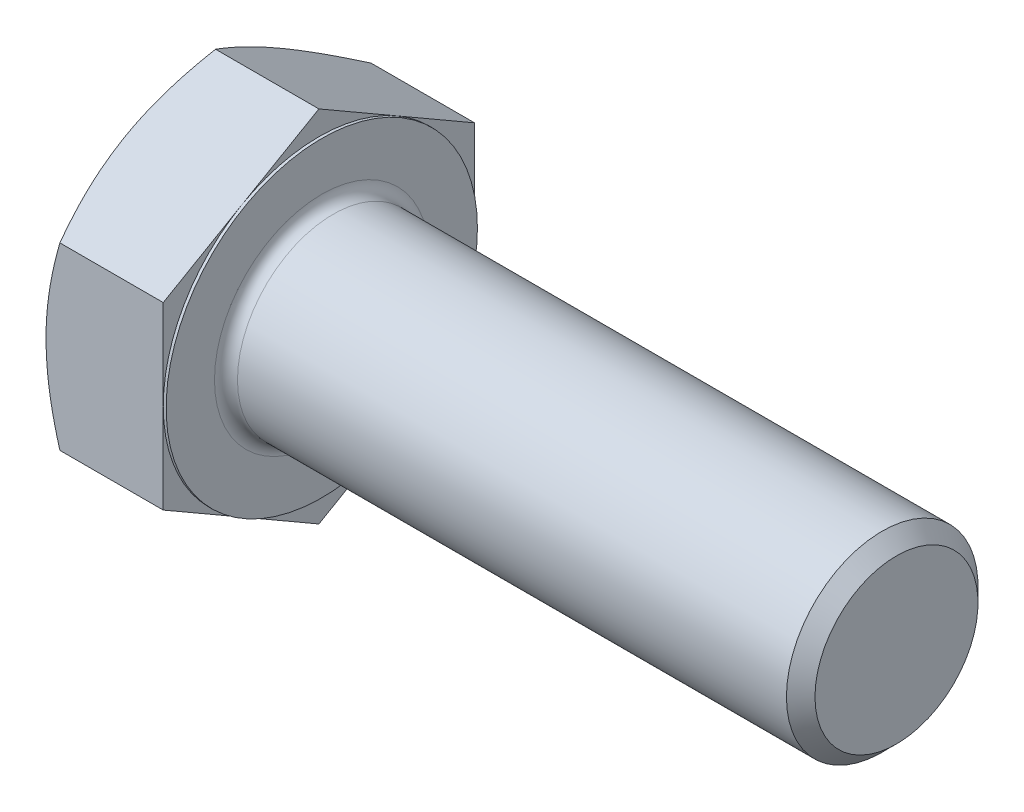
ISO-10303-21;
HEADER;
FILE_DESCRIPTION(('STEP AP214'),'2;1');
FILE_NAME('part.step','',(''),(''),'','','');
FILE_SCHEMA(('AUTOMOTIVE_DESIGN { 1 0 10303 214 1 1 1 1 }'));
ENDSEC;
DATA;
#1=APPLICATION_CONTEXT('core data for automotive mechanical design processes');
#2=APPLICATION_PROTOCOL_DEFINITION('international standard','automotive_design',2000,#1);
#3=PRODUCT_CONTEXT('',#1,'mechanical');
#4=PRODUCT('Part','Part','',(#3));
#5=PRODUCT_RELATED_PRODUCT_CATEGORY('part','',(#4));
#6=PRODUCT_DEFINITION_FORMATION('','',#4);
#7=PRODUCT_DEFINITION_CONTEXT('part definition',#1,'design');
#8=PRODUCT_DEFINITION('design','',#6,#7);
#9=PRODUCT_DEFINITION_SHAPE('','',#8);
#10=(LENGTH_UNIT() NAMED_UNIT(*) SI_UNIT(.MILLI.,.METRE.));
#11=(NAMED_UNIT(*) PLANE_ANGLE_UNIT() SI_UNIT($,.RADIAN.));
#12=(NAMED_UNIT(*) SI_UNIT($,.STERADIAN.) SOLID_ANGLE_UNIT());
#13=UNCERTAINTY_MEASURE_WITH_UNIT(LENGTH_MEASURE(1.E-05),#10,'distance_accuracy_value','');
#14=(GEOMETRIC_REPRESENTATION_CONTEXT(3) GLOBAL_UNCERTAINTY_ASSIGNED_CONTEXT((#13)) GLOBAL_UNIT_ASSIGNED_CONTEXT((#10,
#11,#12)) REPRESENTATION_CONTEXT('',''));
#15=CARTESIAN_POINT('',(0.,0.,0.));
#16=DIRECTION('',(0.,0.,1.));
#17=DIRECTION('',(1.,0.,0.));
#18=AXIS2_PLACEMENT_3D('',#15,#16,#17);
#19=CARTESIAN_POINT('',(15.9258,23.8301323608018,0.));
#20=DIRECTION('',(1.,0.,0.));
#21=DIRECTION('',(0.,0.,-1.));
#22=AXIS2_PLACEMENT_3D('',#19,#20,#21);
#23=PLANE('',#22);
#24=CARTESIAN_POINT('',(15.9258,0.,0.));
#25=DIRECTION('',(1.,0.,0.));
#26=DIRECTION('',(0.,0.,-1.));
#27=AXIS2_PLACEMENT_3D('',#24,#25,#26);
#28=CIRCLE('',#27,14.224);
#29=CARTESIAN_POINT('',(15.9258,0.,-14.224));
#30=VERTEX_POINT('',#29);
#31=EDGE_CURVE('E40',#30,#30,#28,.F.);
#32=ORIENTED_EDGE('',*,*,#31,.T.);
#33=EDGE_LOOP('',(#32));
#34=FACE_BOUND('',#33,.T.);
#35=CARTESIAN_POINT('',(15.9258,0.,0.));
#36=DIRECTION('',(1.,0.,0.));
#37=DIRECTION('',(0.,0.,-1.));
#38=AXIS2_PLACEMENT_3D('',#35,#36,#37);
#39=CIRCLE('',#38,20.6375);
#40=CARTESIAN_POINT('',(15.9258,0.,-20.6375));
#41=VERTEX_POINT('',#40);
#42=EDGE_CURVE('E291',#41,#41,#39,.T.);
#43=ORIENTED_EDGE('',*,*,#42,.T.);
#44=EDGE_LOOP('',(#43));
#45=FACE_BOUND('',#44,.T.);
#46=ADVANCED_FACE('F32',(#34,#45),#23,.T.);
#47=CARTESIAN_POINT('',(0.,0.,0.));
#48=DIRECTION('',(-1.,0.,0.));
#49=DIRECTION('',(0.,0.,1.));
#50=AXIS2_PLACEMENT_3D('',#47,#48,#49);
#51=CYLINDRICAL_SURFACE('',#50,12.7);
#52=CARTESIAN_POINT('',(17.4498,0.,0.));
#53=DIRECTION('',(1.,0.,0.));
#54=DIRECTION('',(0.,0.,-1.));
#55=AXIS2_PLACEMENT_3D('',#52,#53,#54);
#56=CIRCLE('',#55,12.7);
#57=CARTESIAN_POINT('',(17.4498,0.,-12.7));
#58=VERTEX_POINT('',#57);
#59=EDGE_CURVE('E11',#58,#58,#56,.T.);
#60=ORIENTED_EDGE('',*,*,#59,.T.);
#61=EDGE_LOOP('',(#60));
#62=FACE_BOUND('',#61,.T.);
#63=CARTESIAN_POINT('',(90.2335,0.,0.));
#64=DIRECTION('',(-1.,0.,0.));
#65=DIRECTION('',(0.,0.,1.));
#66=AXIS2_PLACEMENT_3D('',#63,#64,#65);
#67=CIRCLE('',#66,12.7);
#68=CARTESIAN_POINT('',(90.2335,0.,12.7));
#69=VERTEX_POINT('',#68);
#70=EDGE_CURVE('E270',#69,#69,#67,.T.);
#71=ORIENTED_EDGE('',*,*,#70,.T.);
#72=EDGE_LOOP('',(#71));
#73=FACE_BOUND('',#72,.T.);
#74=ADVANCED_FACE('F244',(#62,#73),#51,.T.);
#75=CARTESIAN_POINT('',(92.1258,0.,0.));
#76=DIRECTION('',(-1.,0.,0.));
#77=DIRECTION('',(0.,0.,1.));
#78=AXIS2_PLACEMENT_3D('',#75,#76,#77);
#79=CONICAL_SURFACE('',#78,10.8077,0.785398163397441);
#80=ORIENTED_EDGE('',*,*,#70,.F.);
#81=EDGE_LOOP('',(#80));
#82=FACE_BOUND('',#81,.T.);
#83=CARTESIAN_POINT('',(92.1258,0.,0.));
#84=DIRECTION('',(-1.,0.,0.));
#85=DIRECTION('',(0.,0.,1.));
#86=AXIS2_PLACEMENT_3D('',#83,#84,#85);
#87=CIRCLE('',#86,10.8077);
#88=CARTESIAN_POINT('',(92.1258,0.,10.8077));
#89=VERTEX_POINT('',#88);
#90=EDGE_CURVE('E268',#89,#89,#87,.T.);
#91=ORIENTED_EDGE('',*,*,#90,.T.);
#92=EDGE_LOOP('',(#91));
#93=FACE_BOUND('',#92,.T.);
#94=ADVANCED_FACE('F249',(#82,#93),#79,.T.);
#95=CARTESIAN_POINT('',(92.1258,0.,0.));
#96=DIRECTION('',(-1.,0.,0.));
#97=DIRECTION('',(0.,0.,1.));
#98=AXIS2_PLACEMENT_3D('',#95,#96,#97);
#99=PLANE('',#98);
#100=ORIENTED_EDGE('',*,*,#90,.F.);
#101=EDGE_LOOP('',(#100));
#102=FACE_BOUND('',#101,.T.);
#103=ADVANCED_FACE('F256',(#102),#99,.F.);
#104=CARTESIAN_POINT('',(15.5448,20.6375,0.));
#105=DIRECTION('',(1.,0.,0.));
#106=DIRECTION('',(0.,0.,-1.));
#107=AXIS2_PLACEMENT_3D('',#104,#105,#106);
#108=PLANE('',#107);
#109=DIRECTION('',(0.,0.500000000000001,0.866025403784438));
#110=VECTOR('',#109,1.);
#111=CARTESIAN_POINT('',(15.5448,11.9150661804009,-20.6375));
#112=LINE('',#111,#110);
#113=CARTESIAN_POINT('',(15.5448,11.9150661804009,-20.6375));
#114=VERTEX_POINT('',#113);
#115=CARTESIAN_POINT('',(15.5448,17.8725992706013,-10.31875));
#116=VERTEX_POINT('',#115);
#117=EDGE_CURVE('E164',#114,#116,#112,.T.);
#118=ORIENTED_EDGE('',*,*,#117,.T.);
#119=CARTESIAN_POINT('',(15.5448,0.,0.));
#120=DIRECTION('',(-1.,0.,0.));
#121=DIRECTION('',(0.,0.,1.));
#122=AXIS2_PLACEMENT_3D('',#119,#120,#121);
#123=CIRCLE('',#122,20.6375);
#124=CARTESIAN_POINT('',(15.5448,0.,-20.6375));
#125=VERTEX_POINT('',#124);
#126=EDGE_CURVE('E47',#116,#125,#123,.T.);
#127=ORIENTED_EDGE('',*,*,#126,.T.);
#128=DIRECTION('',(0.,1.,0.));
#129=VECTOR('',#128,1.);
#130=CARTESIAN_POINT('',(15.5448,11.9150661804009,-20.6375));
#131=LINE('',#130,#129);
#132=EDGE_CURVE('E294',#125,#114,#131,.T.);
#133=ORIENTED_EDGE('',*,*,#132,.T.);
#134=EDGE_LOOP('',(#118,#127,#133));
#135=FACE_BOUND('',#134,.T.);
#136=ADVANCED_FACE('F259',(#135),#108,.T.);
#137=CARTESIAN_POINT('',(15.5448,23.8301323608018,0.));
#138=VERTEX_POINT('',#137);
#139=EDGE_CURVE('E162',#116,#138,#112,.T.);
#140=ORIENTED_EDGE('',*,*,#139,.T.);
#141=DIRECTION('',(0.,-0.500000000000001,0.866025403784438));
#142=VECTOR('',#141,1.);
#143=CARTESIAN_POINT('',(15.5448,23.8301323608018,0.));
#144=LINE('',#143,#142);
#145=CARTESIAN_POINT('',(15.5448,17.8725992706013,10.31875));
#146=VERTEX_POINT('',#145);
#147=EDGE_CURVE('E161',#138,#146,#144,.T.);
#148=ORIENTED_EDGE('',*,*,#147,.T.);
#149=EDGE_CURVE('E150',#146,#116,#123,.T.);
#150=ORIENTED_EDGE('',*,*,#149,.T.);
#151=EDGE_LOOP('',(#140,#148,#150));
#152=FACE_BOUND('',#151,.T.);
#153=ADVANCED_FACE('F264',(#152),#108,.T.);
#154=CARTESIAN_POINT('',(15.5448,11.9150661804009,20.6375));
#155=VERTEX_POINT('',#154);
#156=EDGE_CURVE('E129',#146,#155,#144,.T.);
#157=ORIENTED_EDGE('',*,*,#156,.T.);
#158=DIRECTION('',(0.,-1.,0.));
#159=VECTOR('',#158,1.);
#160=CARTESIAN_POINT('',(15.5448,11.9150661804009,20.6375));
#161=LINE('',#160,#159);
#162=CARTESIAN_POINT('',(15.5448,0.,20.6375));
#163=VERTEX_POINT('',#162);
#164=EDGE_CURVE('E123',#155,#163,#161,.T.);
#165=ORIENTED_EDGE('',*,*,#164,.T.);
#166=EDGE_CURVE('E127',#163,#146,#123,.T.);
#167=ORIENTED_EDGE('',*,*,#166,.T.);
#168=EDGE_LOOP('',(#157,#165,#167));
#169=FACE_BOUND('',#168,.T.);
#170=ADVANCED_FACE('F125',(#169),#108,.T.);
#171=CARTESIAN_POINT('',(15.5448,-11.9150661804008,20.6375));
#172=VERTEX_POINT('',#171);
#173=EDGE_CURVE('E133',#163,#172,#161,.T.);
#174=ORIENTED_EDGE('',*,*,#173,.T.);
#175=DIRECTION('',(0.,-0.500000000000002,-0.866025403784438));
#176=VECTOR('',#175,1.);
#177=CARTESIAN_POINT('',(15.5448,-23.8301323608018,0.));
#178=LINE('',#177,#176);
#179=CARTESIAN_POINT('',(15.5448,-17.8725992706013,10.31875));
#180=VERTEX_POINT('',#179);
#181=EDGE_CURVE('E140',#172,#180,#178,.T.);
#182=ORIENTED_EDGE('',*,*,#181,.T.);
#183=EDGE_CURVE('E137',#180,#163,#123,.T.);
#184=ORIENTED_EDGE('',*,*,#183,.T.);
#185=EDGE_LOOP('',(#174,#182,#184));
#186=FACE_BOUND('',#185,.T.);
#187=ADVANCED_FACE('F138',(#186),#108,.T.);
#188=CARTESIAN_POINT('',(15.5448,-23.8301323608018,0.));
#189=VERTEX_POINT('',#188);
#190=EDGE_CURVE('E156',#180,#189,#178,.T.);
#191=ORIENTED_EDGE('',*,*,#190,.T.);
#192=DIRECTION('',(0.,0.499999999999999,-0.866025403784439));
#193=VECTOR('',#192,1.);
#194=CARTESIAN_POINT('',(15.5448,-11.9150661804009,-20.6375));
#195=LINE('',#194,#193);
#196=CARTESIAN_POINT('',(15.5448,-17.8725992706014,-10.31875));
#197=VERTEX_POINT('',#196);
#198=EDGE_CURVE('E332',#189,#197,#195,.T.);
#199=ORIENTED_EDGE('',*,*,#198,.T.);
#200=EDGE_CURVE('E144',#197,#180,#123,.T.);
#201=ORIENTED_EDGE('',*,*,#200,.T.);
#202=EDGE_LOOP('',(#191,#199,#201));
#203=FACE_BOUND('',#202,.T.);
#204=ADVANCED_FACE('F333',(#203),#108,.T.);
#205=CARTESIAN_POINT('',(15.5448,-11.9150661804009,-20.6375));
#206=VERTEX_POINT('',#205);
#207=EDGE_CURVE('E151',#197,#206,#195,.T.);
#208=ORIENTED_EDGE('',*,*,#207,.T.);
#209=EDGE_CURVE('E295',#206,#125,#131,.T.);
#210=ORIENTED_EDGE('',*,*,#209,.T.);
#211=EDGE_CURVE('E302',#125,#197,#123,.T.);
#212=ORIENTED_EDGE('',*,*,#211,.T.);
#213=EDGE_LOOP('',(#208,#210,#212));
#214=FACE_BOUND('',#213,.T.);
#215=ADVANCED_FACE('F265',(#214),#108,.T.);
#216=CARTESIAN_POINT('',(0.,0.,0.));
#217=DIRECTION('',(-1.,0.,0.));
#218=DIRECTION('',(0.,0.,1.));
#219=AXIS2_PLACEMENT_3D('',#216,#217,#218);
#220=CYLINDRICAL_SURFACE('',#219,20.6375);
#221=ORIENTED_EDGE('',*,*,#126,.F.);
#222=ORIENTED_EDGE('',*,*,#149,.F.);
#223=ORIENTED_EDGE('',*,*,#166,.F.);
#224=ORIENTED_EDGE('',*,*,#183,.F.);
#225=ORIENTED_EDGE('',*,*,#200,.F.);
#226=ORIENTED_EDGE('',*,*,#211,.F.);
#227=EDGE_LOOP('',(#221,#222,#223,#224,#225,#226));
#228=FACE_BOUND('',#227,.T.);
#229=ORIENTED_EDGE('',*,*,#42,.F.);
#230=EDGE_LOOP('',(#229));
#231=FACE_BOUND('',#230,.T.);
#232=ADVANCED_FACE('F147',(#228,#231),#220,.T.);
#233=CARTESIAN_POINT('',(0.,23.8301323608018,0.));
#234=DIRECTION('',(1.,0.,0.));
#235=DIRECTION('',(0.,0.,-1.));
#236=AXIS2_PLACEMENT_3D('',#233,#234,#235);
#237=PLANE('',#236);
#238=CARTESIAN_POINT('',(0.,0.,0.));
#239=DIRECTION('',(1.,0.,0.));
#240=DIRECTION('',(0.,0.,-1.));
#241=AXIS2_PLACEMENT_3D('',#238,#239,#240);
#242=CIRCLE('',#241,20.6375);
#243=CARTESIAN_POINT('',(0.,0.,-20.6375));
#244=VERTEX_POINT('',#243);
#245=CARTESIAN_POINT('',(0.,17.8725992706013,-10.31875));
#246=VERTEX_POINT('',#245);
#247=EDGE_CURVE('E290',#244,#246,#242,.T.);
#248=ORIENTED_EDGE('',*,*,#247,.F.);
#249=CARTESIAN_POINT('',(0.,-17.8725992706014,-10.31875));
#250=VERTEX_POINT('',#249);
#251=EDGE_CURVE('E286',#250,#244,#242,.T.);
#252=ORIENTED_EDGE('',*,*,#251,.F.);
#253=CARTESIAN_POINT('',(0.,-17.8725992706013,10.31875));
#254=VERTEX_POINT('',#253);
#255=EDGE_CURVE('E289',#254,#250,#242,.T.);
#256=ORIENTED_EDGE('',*,*,#255,.F.);
#257=CARTESIAN_POINT('',(0.,0.,20.6375));
#258=VERTEX_POINT('',#257);
#259=EDGE_CURVE('E325',#258,#254,#242,.T.);
#260=ORIENTED_EDGE('',*,*,#259,.F.);
#261=CARTESIAN_POINT('',(0.,0.,0.));
#262=DIRECTION('',(-1.,0.,0.));
#263=DIRECTION('',(0.,0.,1.));
#264=AXIS2_PLACEMENT_3D('',#261,#262,#263);
#265=CIRCLE('',#264,20.6375);
#266=CARTESIAN_POINT('',(0.,17.8725992706013,10.31875));
#267=VERTEX_POINT('',#266);
#268=EDGE_CURVE('E165',#258,#267,#265,.T.);
#269=ORIENTED_EDGE('',*,*,#268,.T.);
#270=EDGE_CURVE('E348',#246,#267,#242,.T.);
#271=ORIENTED_EDGE('',*,*,#270,.F.);
#272=EDGE_LOOP('',(#248,#252,#256,#260,#269,#271));
#273=FACE_BOUND('',#272,.T.);
#274=ADVANCED_FACE('F194',(#273),#237,.F.);
#275=CARTESIAN_POINT('',(0.,0.,0.));
#276=DIRECTION('',(1.,0.,0.));
#277=DIRECTION('',(0.,0.,-1.));
#278=AXIS2_PLACEMENT_3D('',#275,#276,#277);
#279=CONICAL_SURFACE('',#278,20.6375,1.0471975511966);
#280=CARTESIAN_POINT('',(1.84333382008364,11.914950710347,20.6377));
#281=CARTESIAN_POINT('',(1.69214337600419,12.1768388162799,20.1840964946264));
#282=CARTESIAN_POINT('',(1.54781374226857,12.4397484262674,19.7287236923298));
#283=CARTESIAN_POINT('',(1.27478315292442,12.9676758674181,18.814326541547));
#284=CARTESIAN_POINT('',(1.14608733754576,13.2326943616077,18.3553010446653));
#285=CARTESIAN_POINT('',(0.906054325478838,13.7653517625208,17.4327113632561));
#286=CARTESIAN_POINT('',(0.794758200785631,14.0329953304674,16.9691391052536));
#287=CARTESIAN_POINT('',(0.591914465835048,14.5701421920253,16.0387734499091));
#288=CARTESIAN_POINT('',(0.50036572457894,14.8396453782173,15.571980238623));
#289=CARTESIAN_POINT('',(0.340910585633043,15.3736059110997,14.6471334664341));
#290=CARTESIAN_POINT('',(0.272476417896142,15.6380236169871,14.1891485654163));
#291=CARTESIAN_POINT('',(0.157727822186074,16.1680706173259,13.27108023043));
#292=CARTESIAN_POINT('',(0.111413819990831,16.4336999349996,12.8109967562394));
#293=CARTESIAN_POINT('',(0.0420749613202055,16.9654047822575,11.890056946158));
#294=CARTESIAN_POINT('',(0.0190224305713767,17.2314794034924,11.4292021835745));
#295=CARTESIAN_POINT('',(-0.00329774541931306,17.7638741917795,10.5070673605763));
#296=CARTESIAN_POINT('',(-0.00256612562751956,18.03019435099,10.045787313744));
#297=CARTESIAN_POINT('',(0.0210208772954903,18.528085064253,9.18341530175577));
#298=CARTESIAN_POINT('',(0.0410000333968362,18.759691076882,8.78226192054387));
#299=CARTESIAN_POINT('',(0.0985671327331307,19.2223501741672,7.98091285746198));
#300=CARTESIAN_POINT('',(0.136154823768635,19.4534032666949,7.58071716195798));
#301=CARTESIAN_POINT('',(0.228287552877122,19.9148711564043,6.78143133091973));
#302=CARTESIAN_POINT('',(0.282847925177507,20.1452851855258,6.38234252570475));
#303=CARTESIAN_POINT('',(0.407960382025439,20.605009976384,5.58607583043941));
#304=CARTESIAN_POINT('',(0.478512398814658,20.8343207427911,5.18889793229961));
#305=CARTESIAN_POINT('',(0.71596653239891,21.530459444307,3.98315033215904));
#306=CARTESIAN_POINT('',(0.906558493433515,21.9953095159287,3.17800639020824));
#307=CARTESIAN_POINT('',(1.23103244120646,22.6874510236457,1.97918213281513));
#308=CARTESIAN_POINT('',(1.34550466252447,22.9171109250422,1.58139951513513));
#309=CARTESIAN_POINT('',(1.58603801996833,23.3748421953101,0.788585698818164));
#310=CARTESIAN_POINT('',(1.71209588971682,23.6029139925318,0.393553758256622));
#311=CARTESIAN_POINT('',(1.84333382008365,23.8302478308557,-0.000200000000002177));
#312=B_SPLINE_CURVE_WITH_KNOTS('',3,(#280,#281,#282,#283,#284,#285,#286,#287,#288,#289,#290,
#291,#292,#293,#294,#295,#296,#297,#298,#299,#300,#301,#302,#303,#304,#305,#306,#307,#308,#309,
#310,#311),.UNSPECIFIED.,.F.,.F.,(4,2,2,2,2,2,2,2,2,2,2,2,2,2,2,4),(0.,1.63552456713319,
3.27158542986609,4.91145173081582,6.55122408618254,8.1505234671481,9.74985363083664,
11.3472788131478,12.9446546326435,14.3352468669901,15.7258191850933,17.1176515036881,
18.5094779250488,21.3544387799186,22.7744411084872,24.1940443124036),.UNSPECIFIED.);
#313=CARTESIAN_POINT('',(1.84326715293243,23.8301323608018,0.));
#314=VERTEX_POINT('',#313);
#315=EDGE_CURVE('E213',#267,#314,#312,.T.);
#316=ORIENTED_EDGE('',*,*,#315,.T.);
#317=CARTESIAN_POINT('',(1.84333382008365,23.8302478308557,0.0002));
#318=CARTESIAN_POINT('',(1.69214337600421,23.5683597249228,-0.453403505373618));
#319=CARTESIAN_POINT('',(1.54781374226858,23.3054501149353,-0.908776307670228));
#320=CARTESIAN_POINT('',(1.27478315292444,22.7775226737846,-1.82317345845298));
#321=CARTESIAN_POINT('',(1.14608733754577,22.512504179595,-2.28219895533469));
#322=CARTESIAN_POINT('',(0.906054325478847,21.9798467786819,-3.20478863674389));
#323=CARTESIAN_POINT('',(0.79475820078564,21.7122032107353,-3.66836089474639));
#324=CARTESIAN_POINT('',(0.591914465835055,21.1750563491774,-4.59872655009088));
#325=CARTESIAN_POINT('',(0.500365724578947,20.9055531629854,-5.06551976137699));
#326=CARTESIAN_POINT('',(0.340910585633049,20.371592630103,-5.99036653356587));
#327=CARTESIAN_POINT('',(0.272476417896147,20.1071749242156,-6.44835143458366));
#328=CARTESIAN_POINT('',(0.157727822186078,19.5771279238768,-7.36641976956998));
#329=CARTESIAN_POINT('',(0.111413819990834,19.3114986062031,-7.82650324376062));
#330=CARTESIAN_POINT('',(0.0420749613202066,18.7797937589452,-8.74744305384203));
#331=CARTESIAN_POINT('',(0.019022430571377,18.5137191377103,-9.2082978164255));
#332=CARTESIAN_POINT('',(-0.00329774541931427,17.9813243494232,-10.1304326394237));
#333=CARTESIAN_POINT('',(-0.00256612562752133,17.7150041902127,-10.591712686256));
#334=CARTESIAN_POINT('',(0.0210208772954871,17.2171134769497,-11.4540846982442));
#335=CARTESIAN_POINT('',(0.0410000333968321,16.9855074643207,-11.8552380794561));
#336=CARTESIAN_POINT('',(0.0985671327331258,16.5228483670355,-12.656587142538));
#337=CARTESIAN_POINT('',(0.136154823768631,16.2917952745077,-13.056782838042));
#338=CARTESIAN_POINT('',(0.228287552877117,15.8303273847984,-13.8560686690803));
#339=CARTESIAN_POINT('',(0.282847925177502,15.5999133556769,-14.2551574742953));
#340=CARTESIAN_POINT('',(0.407960382025433,15.1401885648187,-15.0514241695606));
#341=CARTESIAN_POINT('',(0.478512398814649,14.9108777984116,-15.4486020677004));
#342=CARTESIAN_POINT('',(0.715966532398898,14.2147390968957,-16.654349667841));
#343=CARTESIAN_POINT('',(0.906558493433504,13.749889025274,-17.4594936097918));
#344=CARTESIAN_POINT('',(1.23103244120645,13.057747517557,-18.6583178671849));
#345=CARTESIAN_POINT('',(1.34550466252446,12.8280876161605,-19.0561004848649));
#346=CARTESIAN_POINT('',(1.58603801996831,12.3703563458926,-19.8489143011818));
#347=CARTESIAN_POINT('',(1.7120958897168,12.1422845486709,-20.2439462417434));
#348=CARTESIAN_POINT('',(1.84333382008363,11.914950710347,-20.6377));
#349=B_SPLINE_CURVE_WITH_KNOTS('',3,(#317,#318,#319,#320,#321,#322,#323,#324,#325,#326,#327,
#328,#329,#330,#331,#332,#333,#334,#335,#336,#337,#338,#339,#340,#341,#342,#343,#344,#345,#346,
#347,#348),.UNSPECIFIED.,.F.,.F.,(4,2,2,2,2,2,2,2,2,2,2,2,2,2,2,4),(0.,1.63552456713319,
3.27158542986609,4.91145173081583,6.55122408618254,8.1505234671481,9.74985363083665,
11.3472788131478,12.9446546326435,14.3352468669901,15.7258191850933,17.1176515036881,
18.5094779250488,21.3544387799186,22.7744411084872,24.1940443124036),.UNSPECIFIED.);
#350=EDGE_CURVE('E55',#314,#246,#349,.T.);
#351=ORIENTED_EDGE('',*,*,#350,.T.);
#352=ORIENTED_EDGE('',*,*,#270,.T.);
#353=EDGE_LOOP('',(#316,#351,#352));
#354=FACE_BOUND('',#353,.T.);
#355=ADVANCED_FACE('F349',(#354),#279,.T.);
#356=CARTESIAN_POINT('',(10.1233678679264,-32.1118563720228,20.6375));
#357=CARTESIAN_POINT('',(9.90427008759402,-31.6607456968352,20.6375));
#358=CARTESIAN_POINT('',(9.68625680449786,-31.2091085460888,20.6375));
#359=CARTESIAN_POINT('',(9.25264463441763,-30.3046714669,20.6375));
#360=CARTESIAN_POINT('',(9.03704577139592,-29.851871526972,20.6375));
#361=CARTESIAN_POINT('',(8.39418278845544,-28.4914436913444,20.6375));
#362=CARTESIAN_POINT('',(7.97091645494712,-27.5819195637715,20.6375));
#363=CARTESIAN_POINT('',(7.13532758177969,-25.7519215328191,20.6375));
#364=CARTESIAN_POINT('',(6.72307624643973,-24.8314150396297,20.6375));
#365=CARTESIAN_POINT('',(5.91529515061251,-22.9831190900477,20.6375));
#366=CARTESIAN_POINT('',(5.51976460735619,-22.0553299770008,20.6375));
#367=CARTESIAN_POINT('',(4.73729219130504,-20.1605940697453,20.6375));
#368=CARTESIAN_POINT('',(4.35105046715439,-19.1933566306423,20.6375));
#369=CARTESIAN_POINT('',(3.60754060681879,-17.2475981851876,20.6375));
#370=CARTESIAN_POINT('',(3.25027570769021,-16.2690759320958,20.6375));
#371=CARTESIAN_POINT('',(2.57402614646954,-14.3010202867253,20.6375));
#372=CARTESIAN_POINT('',(2.25496489526019,-13.3115134229623,20.6375));
#373=CARTESIAN_POINT('',(1.66527212357813,-11.318212065929,20.6375));
#374=CARTESIAN_POINT('',(1.39462546080807,-10.3144221462795,20.6375));
#375=CARTESIAN_POINT('',(1.03545163612044,-8.80063418686218,20.6375));
#376=CARTESIAN_POINT('',(0.923771740021875,-8.29609693722225,20.6375));
#377=CARTESIAN_POINT('',(0.717329256271048,-7.28355521535114,20.6375));
#378=CARTESIAN_POINT('',(0.622566326003781,-6.77555081355569,20.6375));
#379=CARTESIAN_POINT('',(0.451625499398932,-5.75642686434093,20.6375));
#380=CARTESIAN_POINT('',(0.375446963091418,-5.24530742481211,20.6375));
#381=CARTESIAN_POINT('',(0.243185628597375,-4.22045710355663,20.6375));
#382=CARTESIAN_POINT('',(0.187102816380386,-3.70672622365347,20.6375));
#383=CARTESIAN_POINT('',(0.0968611486188547,-2.68415366617242,20.6375));
#384=CARTESIAN_POINT('',(0.0624231051427364,-2.17533677867888,20.6375));
#385=CARTESIAN_POINT('',(0.0151010187593515,-1.15670325298086,20.6375));
#386=CARTESIAN_POINT('',(0.00221661537602976,-0.646886631639317,20.6375));
#387=CARTESIAN_POINT('',(-0.00169134733722277,0.372835415780186,20.6375));
#388=CARTESIAN_POINT('',(0.0072851629896587,0.882740842135931,20.6375));
#389=CARTESIAN_POINT('',(0.0468787652522877,1.9017164984125,20.6375));
#390=CARTESIAN_POINT('',(0.0774968264110684,2.41078668990359,20.6375));
#391=CARTESIAN_POINT('',(0.17617491370146,3.63103902741007,20.6375));
#392=CARTESIAN_POINT('',(0.254325083050728,4.34141978583087,20.6375));
#393=CARTESIAN_POINT('',(0.448536450463003,5.75698322687912,20.6375));
#394=CARTESIAN_POINT('',(0.56460271519729,6.46216520191579,20.6375));
#395=CARTESIAN_POINT('',(0.830517562096812,7.86663403680342,20.6375));
#396=CARTESIAN_POINT('',(0.980392199432029,8.56591591612025,20.6375));
#397=CARTESIAN_POINT('',(1.30934404041187,9.95750121301223,20.6375));
#398=CARTESIAN_POINT('',(1.48842082542165,10.6498047304764,20.6375));
#399=CARTESIAN_POINT('',(1.8756560837149,12.0426964917778,20.6375));
#400=CARTESIAN_POINT('',(2.08437031813341,12.7431291527127,20.6375));
#401=CARTESIAN_POINT('',(2.52357115148503,14.1370960055512,20.6375));
#402=CARTESIAN_POINT('',(2.75405789458341,14.8306301517432,20.6375));
#403=CARTESIAN_POINT('',(3.2331260037703,16.2111388331317,20.6375));
#404=CARTESIAN_POINT('',(3.48170148429213,16.8981154204069,20.6375));
#405=CARTESIAN_POINT('',(3.99400235115313,18.2663626057979,20.6375));
#406=CARTESIAN_POINT('',(4.25772755691505,18.9476332718146,20.6375));
#407=CARTESIAN_POINT('',(4.8988376291131,20.5590145924699,20.6375));
#408=CARTESIAN_POINT('',(5.28183896278094,21.4868873243947,20.6375));
#409=CARTESIAN_POINT('',(6.06661514119217,23.3346835086338,20.6375));
#410=CARTESIAN_POINT('',(6.46839117294355,24.2546064539635,20.6375));
#411=CARTESIAN_POINT('',(7.28694571952704,26.0879885520055,20.6375));
#412=CARTESIAN_POINT('',(7.703727656904,27.0014461725291,20.6375));
#413=CARTESIAN_POINT('',(8.54925608225559,28.8227686796051,20.6375));
#414=CARTESIAN_POINT('',(8.97800230775764,29.7306336883158,20.6375));
#415=CARTESIAN_POINT('',(9.84569867699957,31.5427118405265,20.6375));
#416=CARTESIAN_POINT('',(10.2846596750131,32.4469197774181,20.6375));
#417=CARTESIAN_POINT('',(11.1705735350971,34.2514113836615,20.6375));
#418=CARTESIAN_POINT('',(11.6175264324881,35.1516950356479,20.6375));
#419=CARTESIAN_POINT('',(12.517991568785,36.9488265919903,20.6375));
#420=CARTESIAN_POINT('',(12.9715029503701,37.845674926365,20.6375));
#421=CARTESIAN_POINT('',(13.8840629457393,39.6365449590598,20.6375));
#422=CARTESIAN_POINT('',(14.3431115489658,40.5305666627652,20.6375));
#423=CARTESIAN_POINT('',(15.6493121814541,43.0582372659198,20.6375));
#424=CARTESIAN_POINT('',(16.5019361837319,44.6890583952701,20.6375));
#425=CARTESIAN_POINT('',(18.218831753076,47.944618806486,20.6375));
#426=CARTESIAN_POINT('',(19.0831037421609,49.5693578652521,20.6375));
#427=CARTESIAN_POINT('',(20.8183569713892,52.8099478810823,20.6375));
#428=CARTESIAN_POINT('',(21.6893156480565,54.4258109286343,20.6375));
#429=CARTESIAN_POINT('',(23.000931669619,56.8467384393976,20.6375));
#430=CARTESIAN_POINT('',(23.4389878760915,57.6532142624228,20.6375));
#431=CARTESIAN_POINT('',(24.3166534691618,59.2653187692752,20.6375));
#432=CARTESIAN_POINT('',(24.7562628533391,60.07094745442,20.6375));
#433=CARTESIAN_POINT('',(25.1965591804146,60.8762006412571,20.6375));
#434=B_SPLINE_CURVE_WITH_KNOTS('',3,(#356,#357,#358,#359,#360,#361,#362,#363,#364,#365,#366,
#367,#368,#369,#370,#371,#372,#373,#374,#375,#376,#377,#378,#379,#380,#381,#382,#383,#384,#385,
#386,#387,#388,#389,#390,#391,#392,#393,#394,#395,#396,#397,#398,#399,#400,#401,#402,#403,#404,
#405,#406,#407,#408,#409,#410,#411,#412,#413,#414,#415,#416,#417,#418,#419,#420,#421,#422,#423,
#424,#425,#426,#427,#428,#429,#430,#431,#432,#433),.UNSPECIFIED.,.F.,.F.,(4,2,2,2,2,2,2,2,2,2,2,
2,2,2,2,2,2,2,2,2,2,2,2,2,2,2,2,2,2,2,2,2,2,2,2,2,2,2,4),(0.,1.5045045719864,3.00902406249654,
6.01850276336142,9.04418712204813,12.0697296787894,15.1938876671237,18.3183941817793,
21.4365280414981,24.5536849523303,26.1036962789161,27.6536762099544,29.2036027585358,
30.7535282249853,32.2830277613178,33.8125017171234,35.341980546395,36.8715278781531,
39.0143441873397,41.1574469550834,43.302207029525,45.4469363599133,47.6391167792206,
49.8313117149286,52.0227965340944,54.2142552372602,57.2254091003985,60.2367535984225,
63.2487893293878,66.2607590341771,69.2760903204203,72.2914349363065,75.3063888886273,
78.3213370934272,83.8420362799441,89.362936027719,94.8698395387971,97.6231396494828,
100.376435471273),.UNSPECIFIED.);
#435=CARTESIAN_POINT('',(1.84326715293242,11.9150661804009,20.6375));
#436=VERTEX_POINT('',#435);
#437=EDGE_CURVE('E225',#258,#436,#434,.T.);
#438=ORIENTED_EDGE('',*,*,#437,.T.);
#439=EDGE_CURVE('E224',#436,#267,#312,.T.);
#440=ORIENTED_EDGE('',*,*,#439,.T.);
#441=ORIENTED_EDGE('',*,*,#268,.F.);
#442=EDGE_LOOP('',(#438,#440,#441));
#443=FACE_BOUND('',#442,.T.);
#444=ADVANCED_FACE('F319',(#443),#279,.T.);
#445=CARTESIAN_POINT('',(1.84326715293241,-11.9150661804008,20.6375));
#446=VERTEX_POINT('',#445);
#447=EDGE_CURVE('E271',#446,#258,#434,.T.);
#448=ORIENTED_EDGE('',*,*,#447,.T.);
#449=ORIENTED_EDGE('',*,*,#259,.T.);
#450=CARTESIAN_POINT('',(1.84333382008364,-23.8302478308556,-0.000200000000000067));
#451=CARTESIAN_POINT('',(1.6921433760042,-23.5683597249228,0.453403505373616));
#452=CARTESIAN_POINT('',(1.54781374226857,-23.3054501149352,0.908776307670226));
#453=CARTESIAN_POINT('',(1.27478315292443,-22.7775226737846,1.82317345845298));
#454=CARTESIAN_POINT('',(1.14608733754576,-22.512504179595,2.28219895533469));
#455=CARTESIAN_POINT('',(0.90605432547884,-21.9798467786819,3.20478863674388));
#456=CARTESIAN_POINT('',(0.794758200785632,-21.7122032107353,3.66836089474639));
#457=CARTESIAN_POINT('',(0.591914465835048,-21.1750563491773,4.59872655009088));
#458=CARTESIAN_POINT('',(0.50036572457894,-20.9055531629854,5.06551976137698));
#459=CARTESIAN_POINT('',(0.340910585633042,-20.371592630103,5.99036653356587));
#460=CARTESIAN_POINT('',(0.27247641789614,-20.1071749242156,6.44835143458365));
#461=CARTESIAN_POINT('',(0.15772782218607,-19.5771279238768,7.36641976956997));
#462=CARTESIAN_POINT('',(0.111413819990826,-19.3114986062031,7.82650324376061));
#463=CARTESIAN_POINT('',(0.0420749613201979,-18.7797937589452,8.74744305384202));
#464=CARTESIAN_POINT('',(0.0190224305713678,-18.5137191377103,9.20829781642549));
#465=CARTESIAN_POINT('',(-0.0032977454193242,-17.9813243494232,10.1304326394237));
#466=CARTESIAN_POINT('',(-0.0025661256275316,-17.7150041902127,10.591712686256));
#467=CARTESIAN_POINT('',(0.0210208772954764,-17.2171134769497,11.4540846982442));
#468=CARTESIAN_POINT('',(0.0410000333968212,-16.9855074643207,11.8552380794561));
#469=CARTESIAN_POINT('',(0.0985671327331147,-16.5228483670355,12.656587142538));
#470=CARTESIAN_POINT('',(0.136154823768619,-16.2917952745077,13.056782838042));
#471=CARTESIAN_POINT('',(0.228287552877106,-15.8303273847983,13.8560686690803));
#472=CARTESIAN_POINT('',(0.28284792517749,-15.5999133556769,14.2551574742953));
#473=CARTESIAN_POINT('',(0.407960382025421,-15.1401885648187,15.0514241695606));
#474=CARTESIAN_POINT('',(0.478512398814638,-14.9108777984115,15.4486020677004));
#475=CARTESIAN_POINT('',(0.715966532398886,-14.2147390968956,16.654349667841));
#476=CARTESIAN_POINT('',(0.90655849343349,-13.7498890252739,17.4594936097918));
#477=CARTESIAN_POINT('',(1.23103244120644,-13.057747517557,18.6583178671849));
#478=CARTESIAN_POINT('',(1.34550466252445,-12.8280876161605,19.0561004848649));
#479=CARTESIAN_POINT('',(1.58603801996831,-12.3703563458926,19.8489143011818));
#480=CARTESIAN_POINT('',(1.7120958897168,-12.1422845486709,20.2439462417434));
#481=CARTESIAN_POINT('',(1.84333382008362,-11.914950710347,20.6377));
#482=B_SPLINE_CURVE_WITH_KNOTS('',3,(#450,#451,#452,#453,#454,#455,#456,#457,#458,#459,#460,
#461,#462,#463,#464,#465,#466,#467,#468,#469,#470,#471,#472,#473,#474,#475,#476,#477,#478,#479,
#480,#481),.UNSPECIFIED.,.F.,.F.,(4,2,2,2,2,2,2,2,2,2,2,2,2,2,2,4),(0.,1.63552456713319,
3.27158542986609,4.91145173081583,6.55122408618254,8.1505234671481,9.74985363083665,
11.3472788131478,12.9446546326435,14.3352468669901,15.7258191850933,17.1176515036881,
18.5094779250488,21.3544387799186,22.7744411084873,24.1940443124036),.UNSPECIFIED.);
#483=EDGE_CURVE('E215',#254,#446,#482,.T.);
#484=ORIENTED_EDGE('',*,*,#483,.T.);
#485=EDGE_LOOP('',(#448,#449,#484));
#486=FACE_BOUND('',#485,.T.);
#487=ADVANCED_FACE('F183',(#486),#279,.T.);
#488=CARTESIAN_POINT('',(1.84326715293242,-23.8301323608018,0.));
#489=VERTEX_POINT('',#488);
#490=EDGE_CURVE('E208',#489,#254,#482,.T.);
#491=ORIENTED_EDGE('',*,*,#490,.T.);
#492=ORIENTED_EDGE('',*,*,#255,.T.);
#493=CARTESIAN_POINT('',(1.84333382008365,-11.9149507103471,-20.6377));
#494=CARTESIAN_POINT('',(1.69214337600421,-12.1768388162799,-20.1840964946264));
#495=CARTESIAN_POINT('',(1.54781374226858,-12.4397484262675,-19.7287236923298));
#496=CARTESIAN_POINT('',(1.27478315292444,-12.9676758674181,-18.814326541547));
#497=CARTESIAN_POINT('',(1.14608733754577,-13.2326943616077,-18.3553010446653));
#498=CARTESIAN_POINT('',(0.90605432547885,-13.7653517625209,-17.4327113632561));
#499=CARTESIAN_POINT('',(0.794758200785644,-14.0329953304674,-16.9691391052536));
#500=CARTESIAN_POINT('',(0.59191446583506,-14.5701421920254,-16.0387734499091));
#501=CARTESIAN_POINT('',(0.500365724578951,-14.8396453782173,-15.571980238623));
#502=CARTESIAN_POINT('',(0.340910585633052,-15.3736059110997,-14.6471334664341));
#503=CARTESIAN_POINT('',(0.272476417896151,-15.6380236169871,-14.1891485654163));
#504=CARTESIAN_POINT('',(0.157727822186084,-16.1680706173259,-13.27108023043));
#505=CARTESIAN_POINT('',(0.111413819990842,-16.4336999349996,-12.8109967562394));
#506=CARTESIAN_POINT('',(0.0420749613202162,-16.9654047822575,-11.890056946158));
#507=CARTESIAN_POINT('',(0.019022430571386,-17.2314794034924,-11.4292021835745));
#508=CARTESIAN_POINT('',(-0.00329774541930533,-17.7638741917796,-10.5070673605763));
#509=CARTESIAN_POINT('',(-0.00256612562751193,-18.03019435099,-10.045787313744));
#510=CARTESIAN_POINT('',(0.0210208772954967,-18.528085064253,-9.18341530175576));
#511=CARTESIAN_POINT('',(0.0410000333968414,-18.759691076882,-8.78226192054386));
#512=CARTESIAN_POINT('',(0.0985671327331357,-19.2223501741672,-7.98091285746197));
#513=CARTESIAN_POINT('',(0.136154823768641,-19.453403266695,-7.58071716195797));
#514=CARTESIAN_POINT('',(0.228287552877129,-19.9148711564044,-6.78143133091972));
#515=CARTESIAN_POINT('',(0.282847925177514,-20.1452851855258,-6.38234252570474));
#516=CARTESIAN_POINT('',(0.407960382025445,-20.605009976384,-5.5860758304394));
#517=CARTESIAN_POINT('',(0.478512398814661,-20.8343207427911,-5.1888979322996));
#518=CARTESIAN_POINT('',(0.71596653239891,-21.530459444307,-3.98315033215903));
#519=CARTESIAN_POINT('',(0.906558493433516,-21.9953095159287,-3.17800639020823));
#520=CARTESIAN_POINT('',(1.23103244120646,-22.6874510236457,-1.97918213281512));
#521=CARTESIAN_POINT('',(1.34550466252447,-22.9171109250422,-1.58139951513513));
#522=CARTESIAN_POINT('',(1.58603801996832,-23.3748421953101,-0.788585698818161));
#523=CARTESIAN_POINT('',(1.71209588971681,-23.6029139925318,-0.393553758256621));
#524=CARTESIAN_POINT('',(1.84333382008364,-23.8302478308556,0.000200000000001641));
#525=B_SPLINE_CURVE_WITH_KNOTS('',3,(#493,#494,#495,#496,#497,#498,#499,#500,#501,#502,#503,
#504,#505,#506,#507,#508,#509,#510,#511,#512,#513,#514,#515,#516,#517,#518,#519,#520,#521,#522,
#523,#524),.UNSPECIFIED.,.F.,.F.,(4,2,2,2,2,2,2,2,2,2,2,2,2,2,2,4),(0.,1.63552456713319,
3.27158542986609,4.91145173081582,6.55122408618254,8.15052346714811,9.74985363083665,
11.3472788131478,12.9446546326435,14.3352468669901,15.7258191850933,17.1176515036881,
18.5094779250488,21.3544387799186,22.7744411084872,24.1940443124036),.UNSPECIFIED.);
#526=EDGE_CURVE('E214',#250,#489,#525,.T.);
#527=ORIENTED_EDGE('',*,*,#526,.T.);
#528=EDGE_LOOP('',(#491,#492,#527));
#529=FACE_BOUND('',#528,.T.);
#530=ADVANCED_FACE('F347',(#529),#279,.T.);
#531=CARTESIAN_POINT('',(1.84326715293241,11.9150661804009,-20.6375));
#532=VERTEX_POINT('',#531);
#533=EDGE_CURVE('E216',#246,#532,#349,.T.);
#534=ORIENTED_EDGE('',*,*,#533,.T.);
#535=CARTESIAN_POINT('',(10.1233678687898,-32.1118563738005,-20.6375));
#536=CARTESIAN_POINT('',(9.9042700884394,-31.660745698583,-20.6375));
#537=CARTESIAN_POINT('',(9.68625680532519,-31.2091085478067,-20.6375));
#538=CARTESIAN_POINT('',(9.25264463520892,-30.3046714685582,-20.6375));
#539=CARTESIAN_POINT('',(9.0370457721692,-29.8518715286003,-20.6375));
#540=CARTESIAN_POINT('',(8.39418278917475,-28.4914436928828,-20.6375));
#541=CARTESIAN_POINT('',(7.97091645563053,-27.58191956525,-20.6375));
#542=CARTESIAN_POINT('',(7.13532758239127,-25.7519215341768,-20.6375));
#543=CARTESIAN_POINT('',(6.72307624701539,-24.8314150409265,-20.6375));
#544=CARTESIAN_POINT('',(5.91529515111693,-22.9831190912223,-20.6375));
#545=CARTESIAN_POINT('',(5.51976460782529,-22.0553299781141,-20.6375));
#546=CARTESIAN_POINT('',(4.73729219170255,-20.1605940707313,-20.6375));
#547=CARTESIAN_POINT('',(4.35105046751572,-19.1933566315623,-20.6375));
#548=CARTESIAN_POINT('',(3.60754060710969,-17.2475981859745,-20.6375));
#549=CARTESIAN_POINT('',(3.25027570794687,-16.2690759328156,-20.6375));
#550=CARTESIAN_POINT('',(2.57402614666105,-14.3010202873097,-20.6375));
#551=CARTESIAN_POINT('',(2.25496489542077,-13.3115134234784,-20.6375));
#552=CARTESIAN_POINT('',(1.66527212368195,-11.3182120663066,-20.6375));
#553=CARTESIAN_POINT('',(1.39462546088606,-10.3144221465869,-20.6375));
#554=CARTESIAN_POINT('',(1.03545163616144,-8.80063418704555,-20.6375));
#555=CARTESIAN_POINT('',(0.923771740049321,-8.29609693735249,-20.6375));
#556=CARTESIAN_POINT('',(0.717329256274898,-7.28355521537437,-20.6375));
#557=CARTESIAN_POINT('',(0.622566325997584,-6.77555081352504,-20.6375));
#558=CARTESIAN_POINT('',(0.451625499376682,-5.75642686420194,-20.6375));
#559=CARTESIAN_POINT('',(0.375446963063161,-5.24530742461867,-20.6375));
#560=CARTESIAN_POINT('',(0.243185628561591,-4.22045710325381,-20.6375));
#561=CARTESIAN_POINT('',(0.187102816343083,-3.70672622329574,-20.6375));
#562=CARTESIAN_POINT('',(0.0968611485833567,-2.684153665706,-20.6375));
#563=CARTESIAN_POINT('',(0.0624231051104749,-2.1753367781587,-20.6375));
#564=CARTESIAN_POINT('',(0.0151010187382951,-1.15670325235328,-20.6375));
#565=CARTESIAN_POINT('',(0.00221661536294186,-0.646886630958093,-20.6375));
#566=CARTESIAN_POINT('',(-0.00169134732976389,0.372835416568283,-20.6375));
#567=CARTESIAN_POINT('',(0.00728516300969706,0.882740842977259,-20.6375));
#568=CARTESIAN_POINT('',(0.0468787653017528,1.90171649935959,-20.6375));
#569=CARTESIAN_POINT('',(0.0774968264773809,2.4107866909032,-20.6375));
#570=CARTESIAN_POINT('',(0.176174913809235,3.6310390284915,-20.6375));
#571=CARTESIAN_POINT('',(0.254325083182429,4.34141978694135,-20.6375));
#572=CARTESIAN_POINT('',(0.448536450643836,5.75698322804644,-20.6375));
#573=CARTESIAN_POINT('',(0.564602715403326,6.46216520311086,-20.6375));
#574=CARTESIAN_POINT('',(0.830517562353664,7.86663403805302,-20.6375));
#575=CARTESIAN_POINT('',(0.980392199714494,8.56591591739662,-20.6375));
#576=CARTESIAN_POINT('',(1.30934404074532,9.95750121434136,-20.6375));
#577=CARTESIAN_POINT('',(1.48842082578047,10.6498047318315,-20.6375));
#578=CARTESIAN_POINT('',(1.8756560841246,12.0426964931856,-20.6375));
#579=CARTESIAN_POINT('',(2.08437031856862,12.7431291541471,-20.6375));
#580=CARTESIAN_POINT('',(2.52357115197047,14.1370960070387,-20.6375));
#581=CARTESIAN_POINT('',(2.75405789509359,14.8306301532571,-20.6375));
#582=CARTESIAN_POINT('',(3.23312600432909,16.2111388346983,-20.6375));
#583=CARTESIAN_POINT('',(3.48170148487481,16.8981154219996,-20.6375));
#584=CARTESIAN_POINT('',(3.99400235178276,18.266362607443,-20.6375));
#585=CARTESIAN_POINT('',(4.25772755756775,18.9476332734859,-20.6375));
#586=CARTESIAN_POINT('',(4.89883762980208,20.5590145941592,-20.6375));
#587=CARTESIAN_POINT('',(5.28183896348165,21.4868873260762,-20.6375));
#588=CARTESIAN_POINT('',(6.06661514191358,23.3346835103007,-20.6375));
#589=CARTESIAN_POINT('',(6.46839117367394,24.2546064556236,-20.6375));
#590=CARTESIAN_POINT('',(7.28694572027324,26.0879885536527,-20.6375));
#591=CARTESIAN_POINT('',(7.70372765765705,27.00144617417,-20.6375));
#592=CARTESIAN_POINT('',(8.54925608302072,28.8227686812344,-20.6375));
#593=CARTESIAN_POINT('',(8.97800230852803,29.7306336899396,-20.6375));
#594=CARTESIAN_POINT('',(9.84569867777912,31.5427118421396,-20.6375));
#595=CARTESIAN_POINT('',(10.2846596757965,32.446919779026,-20.6375));
#596=CARTESIAN_POINT('',(11.1705735358874,34.2514113852593,-20.6375));
#597=CARTESIAN_POINT('',(11.6175264332813,35.1516950372408,-20.6375));
#598=CARTESIAN_POINT('',(12.5179915695833,36.9488265935739,-20.6375));
#599=CARTESIAN_POINT('',(12.9715029511707,37.8456749279442,-20.6375));
#600=CARTESIAN_POINT('',(13.8840629465436,39.6365449606304,-20.6375));
#601=CARTESIAN_POINT('',(14.3431115497718,40.5305666643316,-20.6375));
#602=CARTESIAN_POINT('',(15.649312182267,43.0582372674805,-20.6375));
#603=CARTESIAN_POINT('',(16.5019361845495,44.6890583968295,-20.6375));
#604=CARTESIAN_POINT('',(18.2188317539021,47.9446188080434,-20.6375));
#605=CARTESIAN_POINT('',(19.0831037429907,49.5693578668088,-20.6375));
#606=CARTESIAN_POINT('',(20.8183569722263,52.8099478826387,-20.6375));
#607=CARTESIAN_POINT('',(21.6893156488972,54.4258109301914,-20.6375));
#608=CARTESIAN_POINT('',(23.0009316704646,56.8467384409558,-20.6375));
#609=CARTESIAN_POINT('',(23.4389878769388,57.6532142639815,-20.6375));
#610=CARTESIAN_POINT('',(24.3166534700121,59.2653187708347,-20.6375));
#611=CARTESIAN_POINT('',(24.7562628541909,60.0709474559799,-20.6375));
#612=CARTESIAN_POINT('',(25.1965591812678,60.8762006428176,-20.6375));
#613=B_SPLINE_CURVE_WITH_KNOTS('',3,(#535,#536,#537,#538,#539,#540,#541,#542,#543,#544,#545,
#546,#547,#548,#549,#550,#551,#552,#553,#554,#555,#556,#557,#558,#559,#560,#561,#562,#563,#564,
#565,#566,#567,#568,#569,#570,#571,#572,#573,#574,#575,#576,#577,#578,#579,#580,#581,#582,#583,
#584,#585,#586,#587,#588,#589,#590,#591,#592,#593,#594,#595,#596,#597,#598,#599,#600,#601,#602,
#603,#604,#605,#606,#607,#608,#609,#610,#611,#612),.UNSPECIFIED.,.F.,.F.,(4,2,2,2,2,2,2,2,2,2,2,
2,2,2,2,2,2,2,2,2,2,2,2,2,2,2,2,2,2,2,2,2,2,2,2,2,2,2,4),(0.,1.50450457209063,3.00902406270501,
6.0185027637784,9.04418712267589,12.0697296796279,15.1938876681863,18.3183941830662,
21.4365280430083,24.5536849540638,26.1036962808139,27.6536762120166,29.2036027607621,
30.7535282273757,32.2830277638684,33.8125017198341,35.3419805492658,36.8715278811842,
39.0143441904652,41.1574469583034,43.3022070328395,45.4469363633224,47.6391167827283,
49.8313117185349,52.022796537799,54.2142552410632,57.2254091041934,60.2367536022095,
63.2487893331665,66.2607590379476,69.2760903241818,72.2914349400589,75.3063888923708,
78.3213370971617,83.8420362836819,89.3629360314601,94.8698395425448,97.6231396532339,
100.376435475027),.UNSPECIFIED.);
#614=EDGE_CURVE('E176',#532,#244,#613,.F.);
#615=ORIENTED_EDGE('',*,*,#614,.T.);
#616=ORIENTED_EDGE('',*,*,#247,.T.);
#617=EDGE_LOOP('',(#534,#615,#616));
#618=FACE_BOUND('',#617,.T.);
#619=ADVANCED_FACE('F344',(#618),#279,.T.);
#620=CARTESIAN_POINT('',(1.84326715293243,-11.9150661804009,-20.6375));
#621=VERTEX_POINT('',#620);
#622=EDGE_CURVE('E177',#621,#250,#525,.T.);
#623=ORIENTED_EDGE('',*,*,#622,.T.);
#624=ORIENTED_EDGE('',*,*,#251,.T.);
#625=EDGE_CURVE('E168',#244,#621,#613,.F.);
#626=ORIENTED_EDGE('',*,*,#625,.T.);
#627=EDGE_LOOP('',(#623,#624,#626));
#628=FACE_BOUND('',#627,.T.);
#629=ADVANCED_FACE('F192',(#628),#279,.T.);
#630=CARTESIAN_POINT('',(15.9258,11.9150661804009,-20.6375));
#631=DIRECTION('',(0.,0.,1.));
#632=DIRECTION('',(0.,-1.,0.));
#633=AXIS2_PLACEMENT_3D('',#630,#631,#632);
#634=PLANE('',#633);
#635=ORIENTED_EDGE('',*,*,#209,.F.);
#636=DIRECTION('',(-1.,0.,0.));
#637=VECTOR('',#636,1.);
#638=CARTESIAN_POINT('',(15.9258,-11.9150661804009,-20.6375));
#639=LINE('',#638,#637);
#640=EDGE_CURVE('E277',#206,#621,#639,.T.);
#641=ORIENTED_EDGE('',*,*,#640,.T.);
#642=ORIENTED_EDGE('',*,*,#625,.F.);
#643=ORIENTED_EDGE('',*,*,#614,.F.);
#644=DIRECTION('',(-1.,0.,0.));
#645=VECTOR('',#644,1.);
#646=CARTESIAN_POINT('',(15.9258,11.9150661804009,-20.6375));
#647=LINE('',#646,#645);
#648=EDGE_CURVE('E273',#114,#532,#647,.T.);
#649=ORIENTED_EDGE('',*,*,#648,.F.);
#650=ORIENTED_EDGE('',*,*,#132,.F.);
#651=EDGE_LOOP('',(#635,#641,#642,#643,#649,#650));
#652=FACE_BOUND('',#651,.T.);
#653=ADVANCED_FACE('F187',(#652),#634,.F.);
#654=CARTESIAN_POINT('',(15.9258,-11.9150661804009,-20.6375));
#655=DIRECTION('',(0.,0.866025403784439,0.499999999999999));
#656=DIRECTION('',(0.,-0.499999999999999,0.866025403784439));
#657=AXIS2_PLACEMENT_3D('',#654,#655,#656);
#658=PLANE('',#657);
#659=ORIENTED_EDGE('',*,*,#198,.F.);
#660=DIRECTION('',(-1.,0.,0.));
#661=VECTOR('',#660,1.);
#662=CARTESIAN_POINT('',(15.9258,-23.8301323608018,0.));
#663=LINE('',#662,#661);
#664=EDGE_CURVE('E279',#189,#489,#663,.T.);
#665=ORIENTED_EDGE('',*,*,#664,.T.);
#666=ORIENTED_EDGE('',*,*,#526,.F.);
#667=ORIENTED_EDGE('',*,*,#622,.F.);
#668=ORIENTED_EDGE('',*,*,#640,.F.);
#669=ORIENTED_EDGE('',*,*,#207,.F.);
#670=EDGE_LOOP('',(#659,#665,#666,#667,#668,#669));
#671=FACE_BOUND('',#670,.T.);
#672=ADVANCED_FACE('F191',(#671),#658,.F.);
#673=CARTESIAN_POINT('',(15.9258,-23.8301323608018,0.));
#674=DIRECTION('',(0.,0.866025403784438,-0.500000000000002));
#675=DIRECTION('',(0.,0.500000000000002,0.866025403784438));
#676=AXIS2_PLACEMENT_3D('',#673,#674,#675);
#677=PLANE('',#676);
#678=ORIENTED_EDGE('',*,*,#181,.F.);
#679=DIRECTION('',(-1.,0.,0.));
#680=VECTOR('',#679,1.);
#681=CARTESIAN_POINT('',(15.9258,-11.9150661804008,20.6375));
#682=LINE('',#681,#680);
#683=EDGE_CURVE('E155',#172,#446,#682,.T.);
#684=ORIENTED_EDGE('',*,*,#683,.T.);
#685=ORIENTED_EDGE('',*,*,#483,.F.);
#686=ORIENTED_EDGE('',*,*,#490,.F.);
#687=ORIENTED_EDGE('',*,*,#664,.F.);
#688=ORIENTED_EDGE('',*,*,#190,.F.);
#689=EDGE_LOOP('',(#678,#684,#685,#686,#687,#688));
#690=FACE_BOUND('',#689,.T.);
#691=ADVANCED_FACE('F199',(#690),#677,.F.);
#692=CARTESIAN_POINT('',(15.9258,11.9150661804009,20.6375));
#693=DIRECTION('',(0.,0.,-1.));
#694=DIRECTION('',(-1.,0.,0.));
#695=AXIS2_PLACEMENT_3D('',#692,#693,#694);
#696=PLANE('',#695);
#697=ORIENTED_EDGE('',*,*,#164,.F.);
#698=DIRECTION('',(-1.,0.,0.));
#699=VECTOR('',#698,1.);
#700=CARTESIAN_POINT('',(15.9258,11.9150661804009,20.6375));
#701=LINE('',#700,#699);
#702=EDGE_CURVE('E282',#155,#436,#701,.T.);
#703=ORIENTED_EDGE('',*,*,#702,.T.);
#704=ORIENTED_EDGE('',*,*,#437,.F.);
#705=ORIENTED_EDGE('',*,*,#447,.F.);
#706=ORIENTED_EDGE('',*,*,#683,.F.);
#707=ORIENTED_EDGE('',*,*,#173,.F.);
#708=EDGE_LOOP('',(#697,#703,#704,#705,#706,#707));
#709=FACE_BOUND('',#708,.T.);
#710=ADVANCED_FACE('F153',(#709),#696,.F.);
#711=CARTESIAN_POINT('',(15.9258,23.8301323608018,0.));
#712=DIRECTION('',(0.,-0.866025403784438,-0.500000000000001));
#713=DIRECTION('',(0.,0.500000000000001,-0.866025403784438));
#714=AXIS2_PLACEMENT_3D('',#711,#712,#713);
#715=PLANE('',#714);
#716=ORIENTED_EDGE('',*,*,#147,.F.);
#717=DIRECTION('',(-1.,0.,0.));
#718=VECTOR('',#717,1.);
#719=CARTESIAN_POINT('',(15.9258,23.8301323608018,0.));
#720=LINE('',#719,#718);
#721=EDGE_CURVE('E284',#138,#314,#720,.T.);
#722=ORIENTED_EDGE('',*,*,#721,.T.);
#723=ORIENTED_EDGE('',*,*,#315,.F.);
#724=ORIENTED_EDGE('',*,*,#439,.F.);
#725=ORIENTED_EDGE('',*,*,#702,.F.);
#726=ORIENTED_EDGE('',*,*,#156,.F.);
#727=EDGE_LOOP('',(#716,#722,#723,#724,#725,#726));
#728=FACE_BOUND('',#727,.T.);
#729=ADVANCED_FACE('F230',(#728),#715,.F.);
#730=CARTESIAN_POINT('',(15.9258,11.9150661804009,-20.6375));
#731=DIRECTION('',(0.,-0.866025403784438,0.500000000000001));
#732=DIRECTION('',(0.,-0.500000000000001,-0.866025403784438));
#733=AXIS2_PLACEMENT_3D('',#730,#731,#732);
#734=PLANE('',#733);
#735=ORIENTED_EDGE('',*,*,#117,.F.);
#736=ORIENTED_EDGE('',*,*,#648,.T.);
#737=ORIENTED_EDGE('',*,*,#533,.F.);
#738=ORIENTED_EDGE('',*,*,#350,.F.);
#739=ORIENTED_EDGE('',*,*,#721,.F.);
#740=ORIENTED_EDGE('',*,*,#139,.F.);
#741=EDGE_LOOP('',(#735,#736,#737,#738,#739,#740));
#742=FACE_BOUND('',#741,.T.);
#743=ADVANCED_FACE('F233',(#742),#734,.F.);
#744=CARTESIAN_POINT('',(17.4498,0.,0.));
#745=DIRECTION('',(1.,0.,0.));
#746=DIRECTION('',(0.,0.,-1.));
#747=AXIS2_PLACEMENT_3D('',#744,#745,#746);
#748=TOROIDAL_SURFACE('',#747,14.224,1.524);
#749=ORIENTED_EDGE('',*,*,#59,.F.);
#750=EDGE_LOOP('',(#749));
#751=FACE_BOUND('',#750,.T.);
#752=ORIENTED_EDGE('',*,*,#31,.F.);
#753=EDGE_LOOP('',(#752));
#754=FACE_BOUND('',#753,.T.);
#755=ADVANCED_FACE('F34',(#751,#754),#748,.F.);
#756=CLOSED_SHELL('',(#46,#74,#94,#103,#136,#153,#170,#187,#204,#215,#232,#274,#355,#444,#487,
#530,#619,#629,#653,#672,#691,#710,#729,#743,#755));
#757=MANIFOLD_SOLID_BREP('B2',#756);
#758=ADVANCED_BREP_SHAPE_REPRESENTATION('',(#18,#757),#14);
#759=SHAPE_DEFINITION_REPRESENTATION(#9,#758);
ENDSEC;
END-ISO-10303-21;
